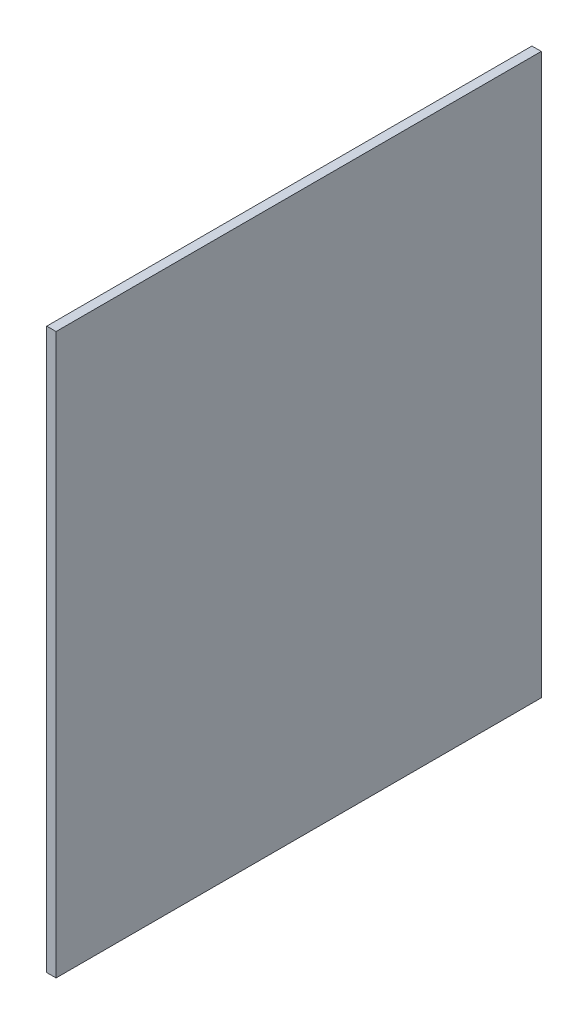
ISO-10303-21;
HEADER;
FILE_DESCRIPTION(('STEP AP214'),'2;1');
FILE_NAME('part.step','',(''),(''),'','','');
FILE_SCHEMA(('AUTOMOTIVE_DESIGN { 1 0 10303 214 1 1 1 1 }'));
ENDSEC;
DATA;
#1=APPLICATION_CONTEXT('core data for automotive mechanical design processes');
#2=APPLICATION_PROTOCOL_DEFINITION('international standard','automotive_design',2000,#1);
#3=PRODUCT_CONTEXT('',#1,'mechanical');
#4=PRODUCT('Part','Part','',(#3));
#5=PRODUCT_RELATED_PRODUCT_CATEGORY('part','',(#4));
#6=PRODUCT_DEFINITION_FORMATION('','',#4);
#7=PRODUCT_DEFINITION_CONTEXT('part definition',#1,'design');
#8=PRODUCT_DEFINITION('design','',#6,#7);
#9=PRODUCT_DEFINITION_SHAPE('','',#8);
#10=(LENGTH_UNIT() NAMED_UNIT(*) SI_UNIT(.MILLI.,.METRE.));
#11=(NAMED_UNIT(*) PLANE_ANGLE_UNIT() SI_UNIT($,.RADIAN.));
#12=(NAMED_UNIT(*) SI_UNIT($,.STERADIAN.) SOLID_ANGLE_UNIT());
#13=UNCERTAINTY_MEASURE_WITH_UNIT(LENGTH_MEASURE(1.E-05),#10,'distance_accuracy_value','');
#14=(GEOMETRIC_REPRESENTATION_CONTEXT(3) GLOBAL_UNCERTAINTY_ASSIGNED_CONTEXT((#13)) GLOBAL_UNIT_ASSIGNED_CONTEXT((#10,
#11,#12)) REPRESENTATION_CONTEXT('',''));
#15=CARTESIAN_POINT('',(0.,0.,0.));
#16=DIRECTION('',(0.,0.,1.));
#17=DIRECTION('',(1.,0.,0.));
#18=AXIS2_PLACEMENT_3D('',#15,#16,#17);
#19=CARTESIAN_POINT('',(5.,0.,260.));
#20=DIRECTION('',(0.,1.,0.));
#21=DIRECTION('',(0.,0.,1.));
#22=AXIS2_PLACEMENT_3D('',#19,#20,#21);
#23=PLANE('',#22);
#24=DIRECTION('',(1.,0.,0.));
#25=VECTOR('',#24,1.);
#26=CARTESIAN_POINT('',(5.,0.,0.));
#27=LINE('',#26,#25);
#28=CARTESIAN_POINT('',(0.,0.,0.));
#29=VERTEX_POINT('',#28);
#30=CARTESIAN_POINT('',(5.,0.,0.));
#31=VERTEX_POINT('',#30);
#32=EDGE_CURVE('E102',#29,#31,#27,.T.);
#33=ORIENTED_EDGE('',*,*,#32,.T.);
#34=DIRECTION('',(0.,0.,-1.));
#35=VECTOR('',#34,1.);
#36=CARTESIAN_POINT('',(5.,0.,260.));
#37=LINE('',#36,#35);
#38=CARTESIAN_POINT('',(5.,0.,260.));
#39=VERTEX_POINT('',#38);
#40=EDGE_CURVE('E11',#39,#31,#37,.T.);
#41=ORIENTED_EDGE('',*,*,#40,.F.);
#42=DIRECTION('',(1.,0.,0.));
#43=VECTOR('',#42,1.);
#44=CARTESIAN_POINT('',(5.,0.,260.));
#45=LINE('',#44,#43);
#46=CARTESIAN_POINT('',(0.,0.,260.));
#47=VERTEX_POINT('',#46);
#48=EDGE_CURVE('E90',#47,#39,#45,.T.);
#49=ORIENTED_EDGE('',*,*,#48,.F.);
#50=DIRECTION('',(0.,0.,-1.));
#51=VECTOR('',#50,1.);
#52=CARTESIAN_POINT('',(0.,0.,260.));
#53=LINE('',#52,#51);
#54=EDGE_CURVE('E98',#47,#29,#53,.T.);
#55=ORIENTED_EDGE('',*,*,#54,.T.);
#56=EDGE_LOOP('',(#33,#41,#49,#55));
#57=FACE_BOUND('',#56,.T.);
#58=ADVANCED_FACE('F39',(#57),#23,.F.);
#59=CARTESIAN_POINT('',(4.99999999999996,300.,260.));
#60=DIRECTION('',(-1.,0.,0.));
#61=DIRECTION('',(0.,-1.,0.));
#62=AXIS2_PLACEMENT_3D('',#59,#60,#61);
#63=PLANE('',#62);
#64=DIRECTION('',(0.,1.,0.));
#65=VECTOR('',#64,1.);
#66=CARTESIAN_POINT('',(4.99999999999996,300.,0.));
#67=LINE('',#66,#65);
#68=CARTESIAN_POINT('',(4.99999999999996,300.,0.));
#69=VERTEX_POINT('',#68);
#70=EDGE_CURVE('E94',#31,#69,#67,.T.);
#71=ORIENTED_EDGE('',*,*,#70,.T.);
#72=DIRECTION('',(0.,0.,-1.));
#73=VECTOR('',#72,1.);
#74=CARTESIAN_POINT('',(4.99999999999996,300.,260.));
#75=LINE('',#74,#73);
#76=CARTESIAN_POINT('',(4.99999999999996,300.,260.));
#77=VERTEX_POINT('',#76);
#78=EDGE_CURVE('E47',#77,#69,#75,.T.);
#79=ORIENTED_EDGE('',*,*,#78,.F.);
#80=DIRECTION('',(0.,1.,0.));
#81=VECTOR('',#80,1.);
#82=CARTESIAN_POINT('',(4.99999999999996,300.,260.));
#83=LINE('',#82,#81);
#84=EDGE_CURVE('E85',#39,#77,#83,.T.);
#85=ORIENTED_EDGE('',*,*,#84,.F.);
#86=ORIENTED_EDGE('',*,*,#40,.T.);
#87=EDGE_LOOP('',(#71,#79,#85,#86));
#88=FACE_BOUND('',#87,.T.);
#89=ADVANCED_FACE('F93',(#88),#63,.F.);
#90=CARTESIAN_POINT('',(0.,300.,260.));
#91=DIRECTION('',(0.,-1.,0.));
#92=DIRECTION('',(0.,0.,-1.));
#93=AXIS2_PLACEMENT_3D('',#90,#91,#92);
#94=PLANE('',#93);
#95=DIRECTION('',(-1.,0.,0.));
#96=VECTOR('',#95,1.);
#97=CARTESIAN_POINT('',(0.,300.,0.));
#98=LINE('',#97,#96);
#99=CARTESIAN_POINT('',(0.,300.,0.));
#100=VERTEX_POINT('',#99);
#101=EDGE_CURVE('E72',#69,#100,#98,.T.);
#102=ORIENTED_EDGE('',*,*,#101,.T.);
#103=DIRECTION('',(0.,0.,-1.));
#104=VECTOR('',#103,1.);
#105=CARTESIAN_POINT('',(0.,300.,260.));
#106=LINE('',#105,#104);
#107=CARTESIAN_POINT('',(0.,300.,260.));
#108=VERTEX_POINT('',#107);
#109=EDGE_CURVE('E95',#108,#100,#106,.T.);
#110=ORIENTED_EDGE('',*,*,#109,.F.);
#111=DIRECTION('',(-1.,0.,0.));
#112=VECTOR('',#111,1.);
#113=CARTESIAN_POINT('',(0.,300.,260.));
#114=LINE('',#113,#112);
#115=EDGE_CURVE('E88',#77,#108,#114,.T.);
#116=ORIENTED_EDGE('',*,*,#115,.F.);
#117=ORIENTED_EDGE('',*,*,#78,.T.);
#118=EDGE_LOOP('',(#102,#110,#116,#117));
#119=FACE_BOUND('',#118,.T.);
#120=ADVANCED_FACE('F96',(#119),#94,.F.);
#121=CARTESIAN_POINT('',(0.,0.,260.));
#122=DIRECTION('',(1.,0.,0.));
#123=DIRECTION('',(0.,0.,-1.));
#124=AXIS2_PLACEMENT_3D('',#121,#122,#123);
#125=PLANE('',#124);
#126=DIRECTION('',(0.,-1.,0.));
#127=VECTOR('',#126,1.);
#128=CARTESIAN_POINT('',(0.,0.,0.));
#129=LINE('',#128,#127);
#130=EDGE_CURVE('E78',#100,#29,#129,.T.);
#131=ORIENTED_EDGE('',*,*,#130,.T.);
#132=ORIENTED_EDGE('',*,*,#54,.F.);
#133=DIRECTION('',(0.,-1.,0.));
#134=VECTOR('',#133,1.);
#135=CARTESIAN_POINT('',(0.,0.,260.));
#136=LINE('',#135,#134);
#137=EDGE_CURVE('E55',#108,#47,#136,.T.);
#138=ORIENTED_EDGE('',*,*,#137,.F.);
#139=ORIENTED_EDGE('',*,*,#109,.T.);
#140=EDGE_LOOP('',(#131,#132,#138,#139));
#141=FACE_BOUND('',#140,.T.);
#142=ADVANCED_FACE('F109',(#141),#125,.F.);
#143=CARTESIAN_POINT('',(0.,0.,260.));
#144=DIRECTION('',(0.,0.,-1.));
#145=DIRECTION('',(-1.,0.,0.));
#146=AXIS2_PLACEMENT_3D('',#143,#144,#145);
#147=PLANE('',#146);
#148=ORIENTED_EDGE('',*,*,#48,.T.);
#149=ORIENTED_EDGE('',*,*,#84,.T.);
#150=ORIENTED_EDGE('',*,*,#115,.T.);
#151=ORIENTED_EDGE('',*,*,#137,.T.);
#152=EDGE_LOOP('',(#148,#149,#150,#151));
#153=FACE_BOUND('',#152,.T.);
#154=ADVANCED_FACE('F86',(#153),#147,.F.);
#155=CARTESIAN_POINT('',(0.,0.,0.));
#156=DIRECTION('',(0.,0.,-1.));
#157=DIRECTION('',(-1.,0.,0.));
#158=AXIS2_PLACEMENT_3D('',#155,#156,#157);
#159=PLANE('',#158);
#160=ORIENTED_EDGE('',*,*,#32,.F.);
#161=ORIENTED_EDGE('',*,*,#130,.F.);
#162=ORIENTED_EDGE('',*,*,#101,.F.);
#163=ORIENTED_EDGE('',*,*,#70,.F.);
#164=EDGE_LOOP('',(#160,#161,#162,#163));
#165=FACE_BOUND('',#164,.T.);
#166=ADVANCED_FACE('F112',(#165),#159,.T.);
#167=CLOSED_SHELL('',(#58,#89,#120,#142,#154,#166));
#168=MANIFOLD_SOLID_BREP('B2',#167);
#169=ADVANCED_BREP_SHAPE_REPRESENTATION('',(#18,#168),#14);
#170=SHAPE_DEFINITION_REPRESENTATION(#9,#169);
ENDSEC;
END-ISO-10303-21;
